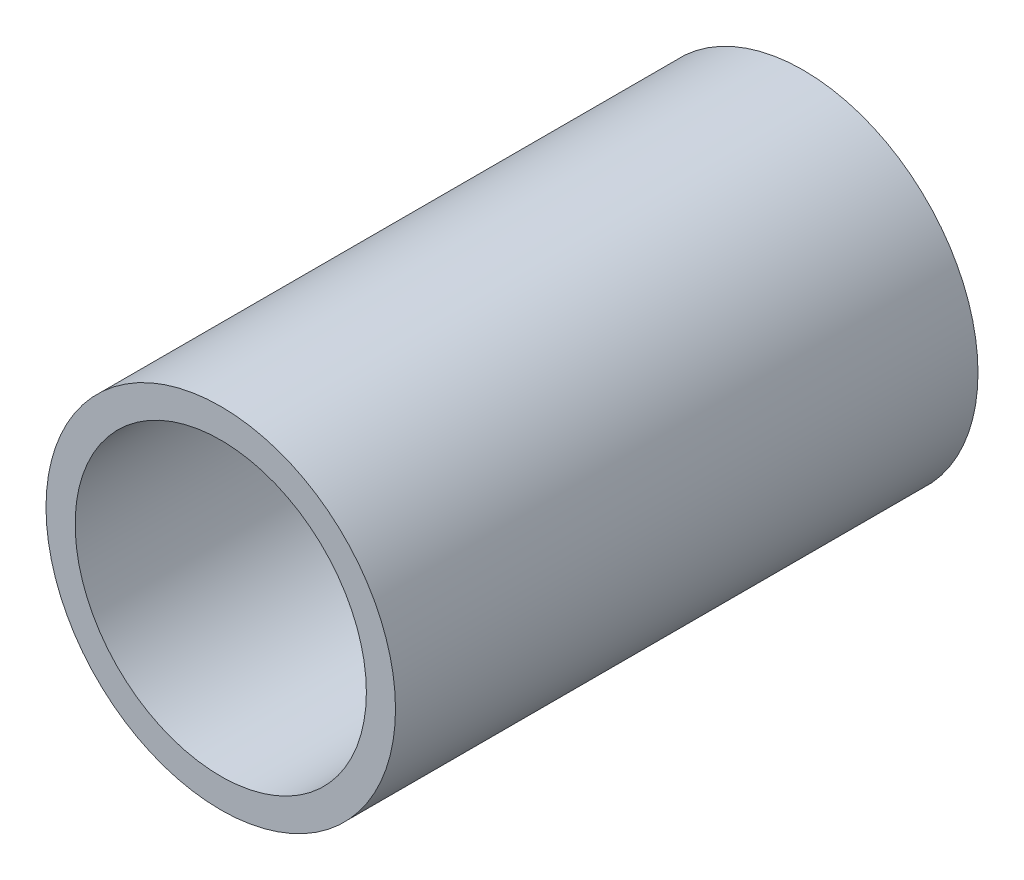
ISO-10303-21;
HEADER;
FILE_DESCRIPTION(('STEP AP214'),'2;1');
FILE_NAME('part.step','',(''),(''),'','','');
FILE_SCHEMA(('AUTOMOTIVE_DESIGN { 1 0 10303 214 1 1 1 1 }'));
ENDSEC;
DATA;
#1=APPLICATION_CONTEXT('core data for automotive mechanical design processes');
#2=APPLICATION_PROTOCOL_DEFINITION('international standard','automotive_design',2000,#1);
#3=PRODUCT_CONTEXT('',#1,'mechanical');
#4=PRODUCT('Part','Part','',(#3));
#5=PRODUCT_RELATED_PRODUCT_CATEGORY('part','',(#4));
#6=PRODUCT_DEFINITION_FORMATION('','',#4);
#7=PRODUCT_DEFINITION_CONTEXT('part definition',#1,'design');
#8=PRODUCT_DEFINITION('design','',#6,#7);
#9=PRODUCT_DEFINITION_SHAPE('','',#8);
#10=(LENGTH_UNIT() NAMED_UNIT(*) SI_UNIT(.MILLI.,.METRE.));
#11=(NAMED_UNIT(*) PLANE_ANGLE_UNIT() SI_UNIT($,.RADIAN.));
#12=(NAMED_UNIT(*) SI_UNIT($,.STERADIAN.) SOLID_ANGLE_UNIT());
#13=UNCERTAINTY_MEASURE_WITH_UNIT(LENGTH_MEASURE(1.E-05),#10,'distance_accuracy_value','');
#14=(GEOMETRIC_REPRESENTATION_CONTEXT(3) GLOBAL_UNCERTAINTY_ASSIGNED_CONTEXT((#13)) GLOBAL_UNIT_ASSIGNED_CONTEXT((#10,
#11,#12)) REPRESENTATION_CONTEXT('',''));
#15=CARTESIAN_POINT('',(0.,0.,0.));
#16=DIRECTION('',(0.,0.,1.));
#17=DIRECTION('',(1.,0.,0.));
#18=AXIS2_PLACEMENT_3D('',#15,#16,#17);
#19=CARTESIAN_POINT('',(0.,0.,25.));
#20=DIRECTION('',(0.,0.,1.));
#21=DIRECTION('',(1.,0.,0.));
#22=AXIS2_PLACEMENT_3D('',#19,#20,#21);
#23=PLANE('',#22);
#24=CARTESIAN_POINT('',(0.,0.,25.));
#25=DIRECTION('',(0.,0.,1.));
#26=DIRECTION('',(1.,0.,0.));
#27=AXIS2_PLACEMENT_3D('',#24,#25,#26);
#28=CIRCLE('',#27,7.5);
#29=CARTESIAN_POINT('',(7.5,0.,25.));
#30=VERTEX_POINT('',#29);
#31=EDGE_CURVE('E10',#30,#30,#28,.T.);
#32=ORIENTED_EDGE('',*,*,#31,.T.);
#33=EDGE_LOOP('',(#32));
#34=FACE_BOUND('',#33,.T.);
#35=CARTESIAN_POINT('',(0.,0.,25.));
#36=DIRECTION('',(0.,0.,1.));
#37=DIRECTION('',(1.,0.,0.));
#38=AXIS2_PLACEMENT_3D('',#35,#36,#37);
#39=CIRCLE('',#38,6.25);
#40=CARTESIAN_POINT('',(6.25,0.,25.));
#41=VERTEX_POINT('',#40);
#42=EDGE_CURVE('E50',#41,#41,#39,.T.);
#43=ORIENTED_EDGE('',*,*,#42,.F.);
#44=EDGE_LOOP('',(#43));
#45=FACE_BOUND('',#44,.T.);
#46=ADVANCED_FACE('F37',(#34,#45),#23,.T.);
#47=CARTESIAN_POINT('',(0.,0.,0.));
#48=DIRECTION('',(0.,0.,1.));
#49=DIRECTION('',(1.,0.,0.));
#50=AXIS2_PLACEMENT_3D('',#47,#48,#49);
#51=PLANE('',#50);
#52=CARTESIAN_POINT('',(0.,0.,0.));
#53=DIRECTION('',(0.,0.,1.));
#54=DIRECTION('',(1.,0.,0.));
#55=AXIS2_PLACEMENT_3D('',#52,#53,#54);
#56=CIRCLE('',#55,7.5);
#57=CARTESIAN_POINT('',(7.5,0.,0.));
#58=VERTEX_POINT('',#57);
#59=EDGE_CURVE('E41',#58,#58,#56,.T.);
#60=ORIENTED_EDGE('',*,*,#59,.F.);
#61=EDGE_LOOP('',(#60));
#62=FACE_BOUND('',#61,.T.);
#63=CARTESIAN_POINT('',(0.,0.,0.));
#64=DIRECTION('',(0.,0.,1.));
#65=DIRECTION('',(1.,0.,0.));
#66=AXIS2_PLACEMENT_3D('',#63,#64,#65);
#67=CIRCLE('',#66,6.25);
#68=CARTESIAN_POINT('',(6.25,0.,0.));
#69=VERTEX_POINT('',#68);
#70=EDGE_CURVE('E52',#69,#69,#67,.T.);
#71=ORIENTED_EDGE('',*,*,#70,.T.);
#72=EDGE_LOOP('',(#71));
#73=FACE_BOUND('',#72,.T.);
#74=ADVANCED_FACE('F64',(#62,#73),#51,.F.);
#75=CARTESIAN_POINT('',(0.,0.,25.));
#76=DIRECTION('',(0.,0.,-1.));
#77=DIRECTION('',(-1.,0.,0.));
#78=AXIS2_PLACEMENT_3D('',#75,#76,#77);
#79=CYLINDRICAL_SURFACE('',#78,7.5);
#80=ORIENTED_EDGE('',*,*,#31,.F.);
#81=EDGE_LOOP('',(#80));
#82=FACE_BOUND('',#81,.T.);
#83=ORIENTED_EDGE('',*,*,#59,.T.);
#84=EDGE_LOOP('',(#83));
#85=FACE_BOUND('',#84,.T.);
#86=ADVANCED_FACE('F39',(#82,#85),#79,.T.);
#87=CARTESIAN_POINT('',(0.,0.,25.));
#88=DIRECTION('',(0.,0.,-1.));
#89=DIRECTION('',(-1.,0.,0.));
#90=AXIS2_PLACEMENT_3D('',#87,#88,#89);
#91=CYLINDRICAL_SURFACE('',#90,6.25);
#92=ORIENTED_EDGE('',*,*,#42,.T.);
#93=EDGE_LOOP('',(#92));
#94=FACE_BOUND('',#93,.T.);
#95=ORIENTED_EDGE('',*,*,#70,.F.);
#96=EDGE_LOOP('',(#95));
#97=FACE_BOUND('',#96,.T.);
#98=ADVANCED_FACE('F60',(#94,#97),#91,.F.);
#99=CLOSED_SHELL('',(#46,#74,#86,#98));
#100=MANIFOLD_SOLID_BREP('B2',#99);
#101=ADVANCED_BREP_SHAPE_REPRESENTATION('',(#18,#100),#14);
#102=SHAPE_DEFINITION_REPRESENTATION(#9,#101);
ENDSEC;
END-ISO-10303-21;
